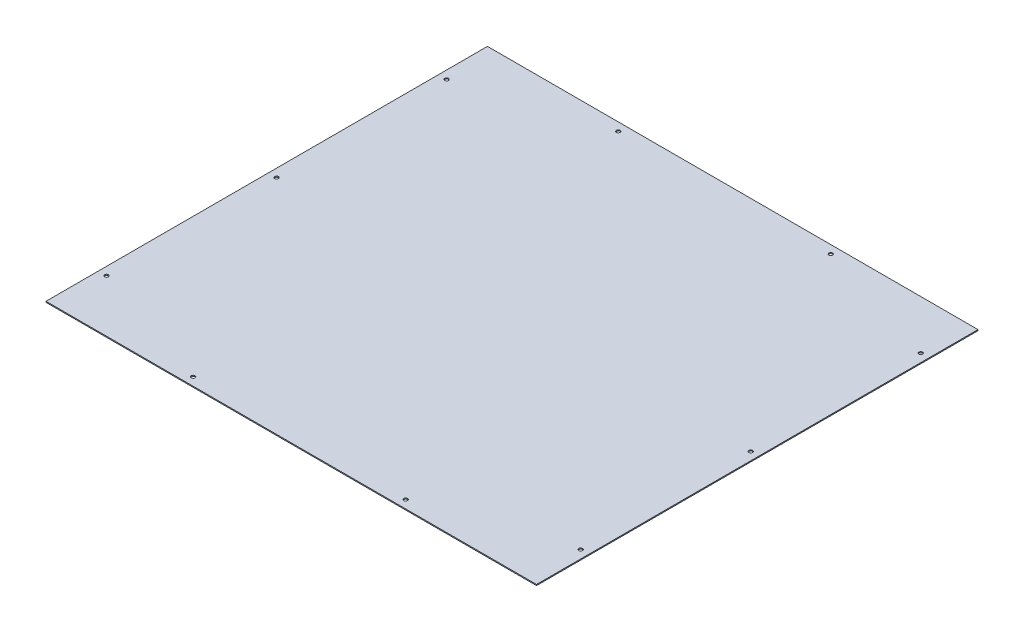
ISO-10303-21;
HEADER;
FILE_DESCRIPTION(('STEP AP214'),'2;1');
FILE_NAME('part.step','',(''),(''),'','','');
FILE_SCHEMA(('AUTOMOTIVE_DESIGN { 1 0 10303 214 1 1 1 1 }'));
ENDSEC;
DATA;
#1=APPLICATION_CONTEXT('core data for automotive mechanical design processes');
#2=APPLICATION_PROTOCOL_DEFINITION('international standard','automotive_design',2000,#1);
#3=PRODUCT_CONTEXT('',#1,'mechanical');
#4=PRODUCT('Part','Part','',(#3));
#5=PRODUCT_RELATED_PRODUCT_CATEGORY('part','',(#4));
#6=PRODUCT_DEFINITION_FORMATION('','',#4);
#7=PRODUCT_DEFINITION_CONTEXT('part definition',#1,'design');
#8=PRODUCT_DEFINITION('design','',#6,#7);
#9=PRODUCT_DEFINITION_SHAPE('','',#8);
#10=(LENGTH_UNIT() NAMED_UNIT(*) SI_UNIT(.MILLI.,.METRE.));
#11=(NAMED_UNIT(*) PLANE_ANGLE_UNIT() SI_UNIT($,.RADIAN.));
#12=(NAMED_UNIT(*) SI_UNIT($,.STERADIAN.) SOLID_ANGLE_UNIT());
#13=UNCERTAINTY_MEASURE_WITH_UNIT(LENGTH_MEASURE(1.E-05),#10,'distance_accuracy_value','');
#14=(GEOMETRIC_REPRESENTATION_CONTEXT(3) GLOBAL_UNCERTAINTY_ASSIGNED_CONTEXT((#13)) GLOBAL_UNIT_ASSIGNED_CONTEXT((#10,
#11,#12)) REPRESENTATION_CONTEXT('',''));
#15=CARTESIAN_POINT('',(0.,0.,0.));
#16=DIRECTION('',(0.,0.,1.));
#17=DIRECTION('',(1.,0.,0.));
#18=AXIS2_PLACEMENT_3D('',#15,#16,#17);
#19=CARTESIAN_POINT('',(0.,-1.5875,0.));
#20=DIRECTION('',(-1.,0.,0.));
#21=DIRECTION('',(0.,0.,1.));
#22=AXIS2_PLACEMENT_3D('',#19,#20,#21);
#23=PLANE('',#22);
#24=DIRECTION('',(0.,0.,1.));
#25=VECTOR('',#24,1.);
#26=CARTESIAN_POINT('',(0.,0.,0.));
#27=LINE('',#26,#25);
#28=CARTESIAN_POINT('',(0.,0.,-685.8));
#29=VERTEX_POINT('',#28);
#30=CARTESIAN_POINT('',(0.,0.,0.));
#31=VERTEX_POINT('',#30);
#32=EDGE_CURVE('E108',#29,#31,#27,.T.);
#33=ORIENTED_EDGE('',*,*,#32,.T.);
#34=DIRECTION('',(0.,1.,0.));
#35=VECTOR('',#34,1.);
#36=CARTESIAN_POINT('',(0.,-1.5875,0.));
#37=LINE('',#36,#35);
#38=CARTESIAN_POINT('',(0.,-1.5875,0.));
#39=VERTEX_POINT('',#38);
#40=EDGE_CURVE('E99',#39,#31,#37,.T.);
#41=ORIENTED_EDGE('',*,*,#40,.F.);
#42=DIRECTION('',(0.,0.,1.));
#43=VECTOR('',#42,1.);
#44=CARTESIAN_POINT('',(0.,-1.5875,0.));
#45=LINE('',#44,#43);
#46=CARTESIAN_POINT('',(0.,-1.5875,-685.8));
#47=VERTEX_POINT('',#46);
#48=EDGE_CURVE('E93',#47,#39,#45,.T.);
#49=ORIENTED_EDGE('',*,*,#48,.F.);
#50=DIRECTION('',(0.,1.,0.));
#51=VECTOR('',#50,1.);
#52=CARTESIAN_POINT('',(0.,-1.5875,-685.8));
#53=LINE('',#52,#51);
#54=EDGE_CURVE('E104',#47,#29,#53,.T.);
#55=ORIENTED_EDGE('',*,*,#54,.T.);
#56=EDGE_LOOP('',(#33,#41,#49,#55));
#57=FACE_BOUND('',#56,.T.);
#58=ADVANCED_FACE('F39',(#57),#23,.F.);
#59=CARTESIAN_POINT('',(0.,-1.5875,0.));
#60=DIRECTION('',(0.,0.,-1.));
#61=DIRECTION('',(-1.,0.,0.));
#62=AXIS2_PLACEMENT_3D('',#59,#60,#61);
#63=PLANE('',#62);
#64=DIRECTION('',(-1.,0.,0.));
#65=VECTOR('',#64,1.);
#66=CARTESIAN_POINT('',(0.,0.,0.));
#67=LINE('',#66,#65);
#68=CARTESIAN_POINT('',(-762.,0.,0.));
#69=VERTEX_POINT('',#68);
#70=EDGE_CURVE('E98',#31,#69,#67,.T.);
#71=ORIENTED_EDGE('',*,*,#70,.T.);
#72=DIRECTION('',(0.,1.,0.));
#73=VECTOR('',#72,1.);
#74=CARTESIAN_POINT('',(-762.,-1.5875,0.));
#75=LINE('',#74,#73);
#76=CARTESIAN_POINT('',(-762.,-1.5875,0.));
#77=VERTEX_POINT('',#76);
#78=EDGE_CURVE('E96',#77,#69,#75,.T.);
#79=ORIENTED_EDGE('',*,*,#78,.F.);
#80=DIRECTION('',(-1.,0.,0.));
#81=VECTOR('',#80,1.);
#82=CARTESIAN_POINT('',(0.,-1.5875,0.));
#83=LINE('',#82,#81);
#84=EDGE_CURVE('E87',#39,#77,#83,.T.);
#85=ORIENTED_EDGE('',*,*,#84,.F.);
#86=ORIENTED_EDGE('',*,*,#40,.T.);
#87=EDGE_LOOP('',(#71,#79,#85,#86));
#88=FACE_BOUND('',#87,.T.);
#89=ADVANCED_FACE('F97',(#88),#63,.F.);
#90=CARTESIAN_POINT('',(-762.,-1.5875,0.));
#91=DIRECTION('',(1.,0.,0.));
#92=DIRECTION('',(0.,0.,-1.));
#93=AXIS2_PLACEMENT_3D('',#90,#91,#92);
#94=PLANE('',#93);
#95=DIRECTION('',(0.,0.,-1.));
#96=VECTOR('',#95,1.);
#97=CARTESIAN_POINT('',(-762.,0.,0.));
#98=LINE('',#97,#96);
#99=CARTESIAN_POINT('',(-762.,0.,-685.8));
#100=VERTEX_POINT('',#99);
#101=EDGE_CURVE('E73',#69,#100,#98,.T.);
#102=ORIENTED_EDGE('',*,*,#101,.T.);
#103=DIRECTION('',(0.,1.,0.));
#104=VECTOR('',#103,1.);
#105=CARTESIAN_POINT('',(-762.,-1.5875,-685.8));
#106=LINE('',#105,#104);
#107=CARTESIAN_POINT('',(-762.,-1.5875,-685.8));
#108=VERTEX_POINT('',#107);
#109=EDGE_CURVE('E100',#108,#100,#106,.T.);
#110=ORIENTED_EDGE('',*,*,#109,.F.);
#111=DIRECTION('',(0.,0.,-1.));
#112=VECTOR('',#111,1.);
#113=CARTESIAN_POINT('',(-762.,-1.5875,0.));
#114=LINE('',#113,#112);
#115=EDGE_CURVE('E91',#77,#108,#114,.T.);
#116=ORIENTED_EDGE('',*,*,#115,.F.);
#117=ORIENTED_EDGE('',*,*,#78,.T.);
#118=EDGE_LOOP('',(#102,#110,#116,#117));
#119=FACE_BOUND('',#118,.T.);
#120=ADVANCED_FACE('F102',(#119),#94,.F.);
#121=CARTESIAN_POINT('',(0.,-1.5875,-685.8));
#122=DIRECTION('',(0.,0.,1.));
#123=DIRECTION('',(1.,0.,0.));
#124=AXIS2_PLACEMENT_3D('',#121,#122,#123);
#125=PLANE('',#124);
#126=DIRECTION('',(1.,0.,0.));
#127=VECTOR('',#126,1.);
#128=CARTESIAN_POINT('',(0.,0.,-685.8));
#129=LINE('',#128,#127);
#130=EDGE_CURVE('E79',#100,#29,#129,.T.);
#131=ORIENTED_EDGE('',*,*,#130,.T.);
#132=ORIENTED_EDGE('',*,*,#54,.F.);
#133=DIRECTION('',(1.,0.,0.));
#134=VECTOR('',#133,1.);
#135=CARTESIAN_POINT('',(0.,-1.5875,-685.8));
#136=LINE('',#135,#134);
#137=EDGE_CURVE('E56',#108,#47,#136,.T.);
#138=ORIENTED_EDGE('',*,*,#137,.F.);
#139=ORIENTED_EDGE('',*,*,#109,.T.);
#140=EDGE_LOOP('',(#131,#132,#138,#139));
#141=FACE_BOUND('',#140,.T.);
#142=ADVANCED_FACE('F135',(#141),#125,.F.);
#143=CARTESIAN_POINT('',(0.,-1.5875,-685.8));
#144=DIRECTION('',(0.,1.,0.));
#145=DIRECTION('',(0.,0.,1.));
#146=AXIS2_PLACEMENT_3D('',#143,#144,#145);
#147=PLANE('',#146);
#148=CARTESIAN_POINT('',(-215.9,-1.5875,-673.1));
#149=DIRECTION('',(0.,-1.,0.));
#150=DIRECTION('',(0.,0.,-1.));
#151=AXIS2_PLACEMENT_3D('',#148,#149,#150);
#152=CIRCLE('',#151,2.89999999999999);
#153=CARTESIAN_POINT('',(-215.9,-1.5875,-676.));
#154=VERTEX_POINT('',#153);
#155=EDGE_CURVE('E235',#154,#154,#152,.T.);
#156=ORIENTED_EDGE('',*,*,#155,.F.);
#157=EDGE_LOOP('',(#156));
#158=FACE_BOUND('',#157,.T.);
#159=CARTESIAN_POINT('',(-546.1,-1.5875,-673.1));
#160=DIRECTION('',(0.,-1.,0.));
#161=DIRECTION('',(0.,0.,-1.));
#162=AXIS2_PLACEMENT_3D('',#159,#160,#161);
#163=CIRCLE('',#162,2.90000000000001);
#164=CARTESIAN_POINT('',(-546.1,-1.5875,-676.));
#165=VERTEX_POINT('',#164);
#166=EDGE_CURVE('E229',#165,#165,#163,.T.);
#167=ORIENTED_EDGE('',*,*,#166,.F.);
#168=EDGE_LOOP('',(#167));
#169=FACE_BOUND('',#168,.T.);
#170=CARTESIAN_POINT('',(-546.1,-1.5875,-12.7000000000002));
#171=DIRECTION('',(0.,-1.,0.));
#172=DIRECTION('',(0.,0.,-1.));
#173=AXIS2_PLACEMENT_3D('',#170,#171,#172);
#174=CIRCLE('',#173,2.90000000000001);
#175=CARTESIAN_POINT('',(-546.1,-1.5875,-15.6000000000002));
#176=VERTEX_POINT('',#175);
#177=EDGE_CURVE('E223',#176,#176,#174,.T.);
#178=ORIENTED_EDGE('',*,*,#177,.F.);
#179=EDGE_LOOP('',(#178));
#180=FACE_BOUND('',#179,.T.);
#181=CARTESIAN_POINT('',(-215.9,-1.5875,-12.7));
#182=DIRECTION('',(0.,-1.,0.));
#183=DIRECTION('',(0.,0.,-1.));
#184=AXIS2_PLACEMENT_3D('',#181,#182,#183);
#185=CIRCLE('',#184,2.89999999999999);
#186=CARTESIAN_POINT('',(-215.9,-1.5875,-15.6));
#187=VERTEX_POINT('',#186);
#188=EDGE_CURVE('E217',#187,#187,#185,.T.);
#189=ORIENTED_EDGE('',*,*,#188,.F.);
#190=EDGE_LOOP('',(#189));
#191=FACE_BOUND('',#190,.T.);
#192=CARTESIAN_POINT('',(-749.3,-1.5875,-345.440000000001));
#193=DIRECTION('',(0.,-1.,0.));
#194=DIRECTION('',(0.,0.,-1.));
#195=AXIS2_PLACEMENT_3D('',#192,#193,#194);
#196=CIRCLE('',#195,2.90000000000001);
#197=CARTESIAN_POINT('',(-749.3,-1.5875,-348.340000000001));
#198=VERTEX_POINT('',#197);
#199=EDGE_CURVE('E208',#198,#198,#196,.T.);
#200=ORIENTED_EDGE('',*,*,#199,.F.);
#201=EDGE_LOOP('',(#200));
#202=FACE_BOUND('',#201,.T.);
#203=CARTESIAN_POINT('',(-12.7,-1.5875,-345.440000000001));
#204=DIRECTION('',(0.,-1.,0.));
#205=DIRECTION('',(0.,0.,-1.));
#206=AXIS2_PLACEMENT_3D('',#203,#204,#205);
#207=CIRCLE('',#206,2.89999999999999);
#208=CARTESIAN_POINT('',(-12.7,-1.5875,-348.340000000001));
#209=VERTEX_POINT('',#208);
#210=EDGE_CURVE('E202',#209,#209,#207,.T.);
#211=ORIENTED_EDGE('',*,*,#210,.F.);
#212=EDGE_LOOP('',(#211));
#213=FACE_BOUND('',#212,.T.);
#214=CARTESIAN_POINT('',(-12.7,-1.5875,-609.6));
#215=DIRECTION('',(0.,-1.,0.));
#216=DIRECTION('',(0.,0.,-1.));
#217=AXIS2_PLACEMENT_3D('',#214,#215,#216);
#218=CIRCLE('',#217,2.89999999999999);
#219=CARTESIAN_POINT('',(-12.7,-1.5875,-612.5));
#220=VERTEX_POINT('',#219);
#221=EDGE_CURVE('E197',#220,#220,#218,.T.);
#222=ORIENTED_EDGE('',*,*,#221,.F.);
#223=EDGE_LOOP('',(#222));
#224=FACE_BOUND('',#223,.T.);
#225=CARTESIAN_POINT('',(-749.3,-1.5875,-609.6));
#226=DIRECTION('',(0.,-1.,0.));
#227=DIRECTION('',(0.,0.,-1.));
#228=AXIS2_PLACEMENT_3D('',#225,#226,#227);
#229=CIRCLE('',#228,2.90000000000001);
#230=CARTESIAN_POINT('',(-749.3,-1.5875,-612.5));
#231=VERTEX_POINT('',#230);
#232=EDGE_CURVE('E191',#231,#231,#229,.T.);
#233=ORIENTED_EDGE('',*,*,#232,.F.);
#234=EDGE_LOOP('',(#233));
#235=FACE_BOUND('',#234,.T.);
#236=ORIENTED_EDGE('',*,*,#48,.T.);
#237=ORIENTED_EDGE('',*,*,#84,.T.);
#238=ORIENTED_EDGE('',*,*,#115,.T.);
#239=ORIENTED_EDGE('',*,*,#137,.T.);
#240=EDGE_LOOP('',(#236,#237,#238,#239));
#241=FACE_BOUND('',#240,.T.);
#242=CARTESIAN_POINT('',(-12.7,-1.5875,-81.2800000000014));
#243=DIRECTION('',(0.,-1.,0.));
#244=DIRECTION('',(0.,0.,-1.));
#245=AXIS2_PLACEMENT_3D('',#242,#243,#244);
#246=CIRCLE('',#245,2.89999999999999);
#247=CARTESIAN_POINT('',(-12.7,-1.5875,-84.1800000000013));
#248=VERTEX_POINT('',#247);
#249=EDGE_CURVE('E121',#248,#248,#246,.T.);
#250=ORIENTED_EDGE('',*,*,#249,.F.);
#251=EDGE_LOOP('',(#250));
#252=FACE_BOUND('',#251,.T.);
#253=CARTESIAN_POINT('',(-749.3,-1.5875,-81.2800000000014));
#254=DIRECTION('',(0.,-1.,0.));
#255=DIRECTION('',(0.,0.,-1.));
#256=AXIS2_PLACEMENT_3D('',#253,#254,#255);
#257=CIRCLE('',#256,2.90000000000001);
#258=CARTESIAN_POINT('',(-749.3,-1.5875,-84.1800000000014));
#259=VERTEX_POINT('',#258);
#260=EDGE_CURVE('E11',#259,#259,#257,.T.);
#261=ORIENTED_EDGE('',*,*,#260,.F.);
#262=EDGE_LOOP('',(#261));
#263=FACE_BOUND('',#262,.T.);
#264=ADVANCED_FACE('F88',(#158,#169,#180,#191,#202,#213,#224,#235,#241,#252,#263),#147,.F.);
#265=CARTESIAN_POINT('',(0.,0.,-685.8));
#266=DIRECTION('',(0.,1.,0.));
#267=DIRECTION('',(0.,0.,1.));
#268=AXIS2_PLACEMENT_3D('',#265,#266,#267);
#269=PLANE('',#268);
#270=CARTESIAN_POINT('',(-215.9,0.,-673.1));
#271=DIRECTION('',(0.,-1.,0.));
#272=DIRECTION('',(0.,0.,-1.));
#273=AXIS2_PLACEMENT_3D('',#270,#271,#272);
#274=CIRCLE('',#273,2.89999999999999);
#275=CARTESIAN_POINT('',(-215.9,0.,-676.));
#276=VERTEX_POINT('',#275);
#277=EDGE_CURVE('E232',#276,#276,#274,.T.);
#278=ORIENTED_EDGE('',*,*,#277,.T.);
#279=EDGE_LOOP('',(#278));
#280=FACE_BOUND('',#279,.T.);
#281=CARTESIAN_POINT('',(-546.1,0.,-673.1));
#282=DIRECTION('',(0.,-1.,0.));
#283=DIRECTION('',(0.,0.,-1.));
#284=AXIS2_PLACEMENT_3D('',#281,#282,#283);
#285=CIRCLE('',#284,2.90000000000001);
#286=CARTESIAN_POINT('',(-546.1,0.,-676.));
#287=VERTEX_POINT('',#286);
#288=EDGE_CURVE('E226',#287,#287,#285,.T.);
#289=ORIENTED_EDGE('',*,*,#288,.T.);
#290=EDGE_LOOP('',(#289));
#291=FACE_BOUND('',#290,.T.);
#292=CARTESIAN_POINT('',(-546.1,0.,-12.7000000000002));
#293=DIRECTION('',(0.,-1.,0.));
#294=DIRECTION('',(0.,0.,-1.));
#295=AXIS2_PLACEMENT_3D('',#292,#293,#294);
#296=CIRCLE('',#295,2.90000000000001);
#297=CARTESIAN_POINT('',(-546.1,0.,-15.6000000000002));
#298=VERTEX_POINT('',#297);
#299=EDGE_CURVE('E220',#298,#298,#296,.T.);
#300=ORIENTED_EDGE('',*,*,#299,.T.);
#301=EDGE_LOOP('',(#300));
#302=FACE_BOUND('',#301,.T.);
#303=CARTESIAN_POINT('',(-215.9,0.,-12.7));
#304=DIRECTION('',(0.,-1.,0.));
#305=DIRECTION('',(0.,0.,-1.));
#306=AXIS2_PLACEMENT_3D('',#303,#304,#305);
#307=CIRCLE('',#306,2.89999999999999);
#308=CARTESIAN_POINT('',(-215.9,0.,-15.6));
#309=VERTEX_POINT('',#308);
#310=EDGE_CURVE('E214',#309,#309,#307,.T.);
#311=ORIENTED_EDGE('',*,*,#310,.T.);
#312=EDGE_LOOP('',(#311));
#313=FACE_BOUND('',#312,.T.);
#314=CARTESIAN_POINT('',(-749.3,0.,-345.440000000001));
#315=DIRECTION('',(0.,-1.,0.));
#316=DIRECTION('',(0.,0.,-1.));
#317=AXIS2_PLACEMENT_3D('',#314,#315,#316);
#318=CIRCLE('',#317,2.90000000000001);
#319=CARTESIAN_POINT('',(-749.3,0.,-348.340000000001));
#320=VERTEX_POINT('',#319);
#321=EDGE_CURVE('E211',#320,#320,#318,.T.);
#322=ORIENTED_EDGE('',*,*,#321,.T.);
#323=EDGE_LOOP('',(#322));
#324=FACE_BOUND('',#323,.T.);
#325=CARTESIAN_POINT('',(-12.7,0.,-345.440000000001));
#326=DIRECTION('',(0.,-1.,0.));
#327=DIRECTION('',(0.,0.,-1.));
#328=AXIS2_PLACEMENT_3D('',#325,#326,#327);
#329=CIRCLE('',#328,2.9);
#330=CARTESIAN_POINT('',(-12.7,0.,-348.340000000001));
#331=VERTEX_POINT('',#330);
#332=EDGE_CURVE('E205',#331,#331,#329,.T.);
#333=ORIENTED_EDGE('',*,*,#332,.T.);
#334=EDGE_LOOP('',(#333));
#335=FACE_BOUND('',#334,.T.);
#336=CARTESIAN_POINT('',(-12.7,0.,-609.6));
#337=DIRECTION('',(0.,-1.,0.));
#338=DIRECTION('',(0.,0.,-1.));
#339=AXIS2_PLACEMENT_3D('',#336,#337,#338);
#340=CIRCLE('',#339,2.9);
#341=CARTESIAN_POINT('',(-12.7,0.,-612.5));
#342=VERTEX_POINT('',#341);
#343=EDGE_CURVE('E193',#342,#342,#340,.T.);
#344=ORIENTED_EDGE('',*,*,#343,.T.);
#345=EDGE_LOOP('',(#344));
#346=FACE_BOUND('',#345,.T.);
#347=CARTESIAN_POINT('',(-749.3,0.,-609.6));
#348=DIRECTION('',(0.,-1.,0.));
#349=DIRECTION('',(0.,0.,-1.));
#350=AXIS2_PLACEMENT_3D('',#347,#348,#349);
#351=CIRCLE('',#350,2.90000000000001);
#352=CARTESIAN_POINT('',(-749.3,0.,-612.5));
#353=VERTEX_POINT('',#352);
#354=EDGE_CURVE('E111',#353,#353,#351,.T.);
#355=ORIENTED_EDGE('',*,*,#354,.T.);
#356=EDGE_LOOP('',(#355));
#357=FACE_BOUND('',#356,.T.);
#358=ORIENTED_EDGE('',*,*,#32,.F.);
#359=ORIENTED_EDGE('',*,*,#130,.F.);
#360=ORIENTED_EDGE('',*,*,#101,.F.);
#361=ORIENTED_EDGE('',*,*,#70,.F.);
#362=EDGE_LOOP('',(#358,#359,#360,#361));
#363=FACE_BOUND('',#362,.T.);
#364=CARTESIAN_POINT('',(-12.7,0.,-81.2800000000014));
#365=DIRECTION('',(0.,-1.,0.));
#366=DIRECTION('',(0.,0.,-1.));
#367=AXIS2_PLACEMENT_3D('',#364,#365,#366);
#368=CIRCLE('',#367,2.9);
#369=CARTESIAN_POINT('',(-12.7,0.,-84.1800000000014));
#370=VERTEX_POINT('',#369);
#371=EDGE_CURVE('E118',#370,#370,#368,.T.);
#372=ORIENTED_EDGE('',*,*,#371,.T.);
#373=EDGE_LOOP('',(#372));
#374=FACE_BOUND('',#373,.T.);
#375=CARTESIAN_POINT('',(-749.3,0.,-81.2800000000014));
#376=DIRECTION('',(0.,-1.,0.));
#377=DIRECTION('',(0.,0.,-1.));
#378=AXIS2_PLACEMENT_3D('',#375,#376,#377);
#379=CIRCLE('',#378,2.90000000000001);
#380=CARTESIAN_POINT('',(-749.3,0.,-84.1800000000014));
#381=VERTEX_POINT('',#380);
#382=EDGE_CURVE('E48',#381,#381,#379,.T.);
#383=ORIENTED_EDGE('',*,*,#382,.T.);
#384=EDGE_LOOP('',(#383));
#385=FACE_BOUND('',#384,.T.);
#386=ADVANCED_FACE('F126',(#280,#291,#302,#313,#324,#335,#346,#357,#363,#374,#385),#269,.T.);
#387=CARTESIAN_POINT('',(-749.3,-1.5875,-609.6));
#388=DIRECTION('',(0.,-1.,0.));
#389=DIRECTION('',(0.,0.,-1.));
#390=AXIS2_PLACEMENT_3D('',#387,#388,#389);
#391=CYLINDRICAL_SURFACE('',#390,2.90000000000001);
#392=ORIENTED_EDGE('',*,*,#354,.F.);
#393=EDGE_LOOP('',(#392));
#394=FACE_BOUND('',#393,.T.);
#395=ORIENTED_EDGE('',*,*,#232,.T.);
#396=EDGE_LOOP('',(#395));
#397=FACE_BOUND('',#396,.T.);
#398=ADVANCED_FACE('F142',(#394,#397),#391,.F.);
#399=CARTESIAN_POINT('',(-12.7,-1.5875,-609.6));
#400=DIRECTION('',(0.,-1.,0.));
#401=DIRECTION('',(0.,0.,-1.));
#402=AXIS2_PLACEMENT_3D('',#399,#400,#401);
#403=CYLINDRICAL_SURFACE('',#402,2.89999999999999);
#404=ORIENTED_EDGE('',*,*,#343,.F.);
#405=EDGE_LOOP('',(#404));
#406=FACE_BOUND('',#405,.T.);
#407=ORIENTED_EDGE('',*,*,#221,.T.);
#408=EDGE_LOOP('',(#407));
#409=FACE_BOUND('',#408,.T.);
#410=ADVANCED_FACE('F167',(#406,#409),#403,.F.);
#411=CARTESIAN_POINT('',(-12.7,-1.5875,-345.440000000001));
#412=DIRECTION('',(0.,-1.,0.));
#413=DIRECTION('',(0.,0.,-1.));
#414=AXIS2_PLACEMENT_3D('',#411,#412,#413);
#415=CYLINDRICAL_SURFACE('',#414,2.89999999999999);
#416=ORIENTED_EDGE('',*,*,#332,.F.);
#417=EDGE_LOOP('',(#416));
#418=FACE_BOUND('',#417,.T.);
#419=ORIENTED_EDGE('',*,*,#210,.T.);
#420=EDGE_LOOP('',(#419));
#421=FACE_BOUND('',#420,.T.);
#422=ADVANCED_FACE('F159',(#418,#421),#415,.F.);
#423=CARTESIAN_POINT('',(-12.7,-1.5875,-81.2800000000014));
#424=DIRECTION('',(0.,-1.,0.));
#425=DIRECTION('',(0.,0.,-1.));
#426=AXIS2_PLACEMENT_3D('',#423,#424,#425);
#427=CYLINDRICAL_SURFACE('',#426,2.89999999999999);
#428=ORIENTED_EDGE('',*,*,#371,.F.);
#429=EDGE_LOOP('',(#428));
#430=FACE_BOUND('',#429,.T.);
#431=ORIENTED_EDGE('',*,*,#249,.T.);
#432=EDGE_LOOP('',(#431));
#433=FACE_BOUND('',#432,.T.);
#434=ADVANCED_FACE('F157',(#430,#433),#427,.F.);
#435=CARTESIAN_POINT('',(-749.3,-1.5875,-345.440000000001));
#436=DIRECTION('',(0.,-1.,0.));
#437=DIRECTION('',(0.,0.,-1.));
#438=AXIS2_PLACEMENT_3D('',#435,#436,#437);
#439=CYLINDRICAL_SURFACE('',#438,2.90000000000001);
#440=ORIENTED_EDGE('',*,*,#321,.F.);
#441=EDGE_LOOP('',(#440));
#442=FACE_BOUND('',#441,.T.);
#443=ORIENTED_EDGE('',*,*,#199,.T.);
#444=EDGE_LOOP('',(#443));
#445=FACE_BOUND('',#444,.T.);
#446=ADVANCED_FACE('F131',(#442,#445),#439,.F.);
#447=CARTESIAN_POINT('',(-749.3,-1.5875,-81.2800000000014));
#448=DIRECTION('',(0.,-1.,0.));
#449=DIRECTION('',(0.,0.,-1.));
#450=AXIS2_PLACEMENT_3D('',#447,#448,#449);
#451=CYLINDRICAL_SURFACE('',#450,2.90000000000001);
#452=ORIENTED_EDGE('',*,*,#382,.F.);
#453=EDGE_LOOP('',(#452));
#454=FACE_BOUND('',#453,.T.);
#455=ORIENTED_EDGE('',*,*,#260,.T.);
#456=EDGE_LOOP('',(#455));
#457=FACE_BOUND('',#456,.T.);
#458=ADVANCED_FACE('F41',(#454,#457),#451,.F.);
#459=CARTESIAN_POINT('',(-215.9,-1.5875,-12.7));
#460=DIRECTION('',(0.,-1.,0.));
#461=DIRECTION('',(0.,0.,-1.));
#462=AXIS2_PLACEMENT_3D('',#459,#460,#461);
#463=CYLINDRICAL_SURFACE('',#462,2.89999999999999);
#464=ORIENTED_EDGE('',*,*,#310,.F.);
#465=EDGE_LOOP('',(#464));
#466=FACE_BOUND('',#465,.T.);
#467=ORIENTED_EDGE('',*,*,#188,.T.);
#468=EDGE_LOOP('',(#467));
#469=FACE_BOUND('',#468,.T.);
#470=ADVANCED_FACE('F130',(#466,#469),#463,.F.);
#471=CARTESIAN_POINT('',(-546.1,-1.5875,-12.7000000000002));
#472=DIRECTION('',(0.,-1.,0.));
#473=DIRECTION('',(0.,0.,-1.));
#474=AXIS2_PLACEMENT_3D('',#471,#472,#473);
#475=CYLINDRICAL_SURFACE('',#474,2.90000000000001);
#476=ORIENTED_EDGE('',*,*,#299,.F.);
#477=EDGE_LOOP('',(#476));
#478=FACE_BOUND('',#477,.T.);
#479=ORIENTED_EDGE('',*,*,#177,.T.);
#480=EDGE_LOOP('',(#479));
#481=FACE_BOUND('',#480,.T.);
#482=ADVANCED_FACE('F246',(#478,#481),#475,.F.);
#483=CARTESIAN_POINT('',(-546.1,-1.5875,-673.1));
#484=DIRECTION('',(0.,-1.,0.));
#485=DIRECTION('',(0.,0.,-1.));
#486=AXIS2_PLACEMENT_3D('',#483,#484,#485);
#487=CYLINDRICAL_SURFACE('',#486,2.90000000000001);
#488=ORIENTED_EDGE('',*,*,#288,.F.);
#489=EDGE_LOOP('',(#488));
#490=FACE_BOUND('',#489,.T.);
#491=ORIENTED_EDGE('',*,*,#166,.T.);
#492=EDGE_LOOP('',(#491));
#493=FACE_BOUND('',#492,.T.);
#494=ADVANCED_FACE('F240',(#490,#493),#487,.F.);
#495=CARTESIAN_POINT('',(-215.9,-1.5875,-673.1));
#496=DIRECTION('',(0.,-1.,0.));
#497=DIRECTION('',(0.,0.,-1.));
#498=AXIS2_PLACEMENT_3D('',#495,#496,#497);
#499=CYLINDRICAL_SURFACE('',#498,2.89999999999999);
#500=ORIENTED_EDGE('',*,*,#277,.F.);
#501=EDGE_LOOP('',(#500));
#502=FACE_BOUND('',#501,.T.);
#503=ORIENTED_EDGE('',*,*,#155,.T.);
#504=EDGE_LOOP('',(#503));
#505=FACE_BOUND('',#504,.T.);
#506=ADVANCED_FACE('F238',(#502,#505),#499,.F.);
#507=CLOSED_SHELL('',(#58,#89,#120,#142,#264,#386,#398,#410,#422,#434,#446,#458,#470,#482,#494,#506));
#508=MANIFOLD_SOLID_BREP('B2',#507);
#509=ADVANCED_BREP_SHAPE_REPRESENTATION('',(#18,#508),#14);
#510=SHAPE_DEFINITION_REPRESENTATION(#9,#509);
ENDSEC;
END-ISO-10303-21;
